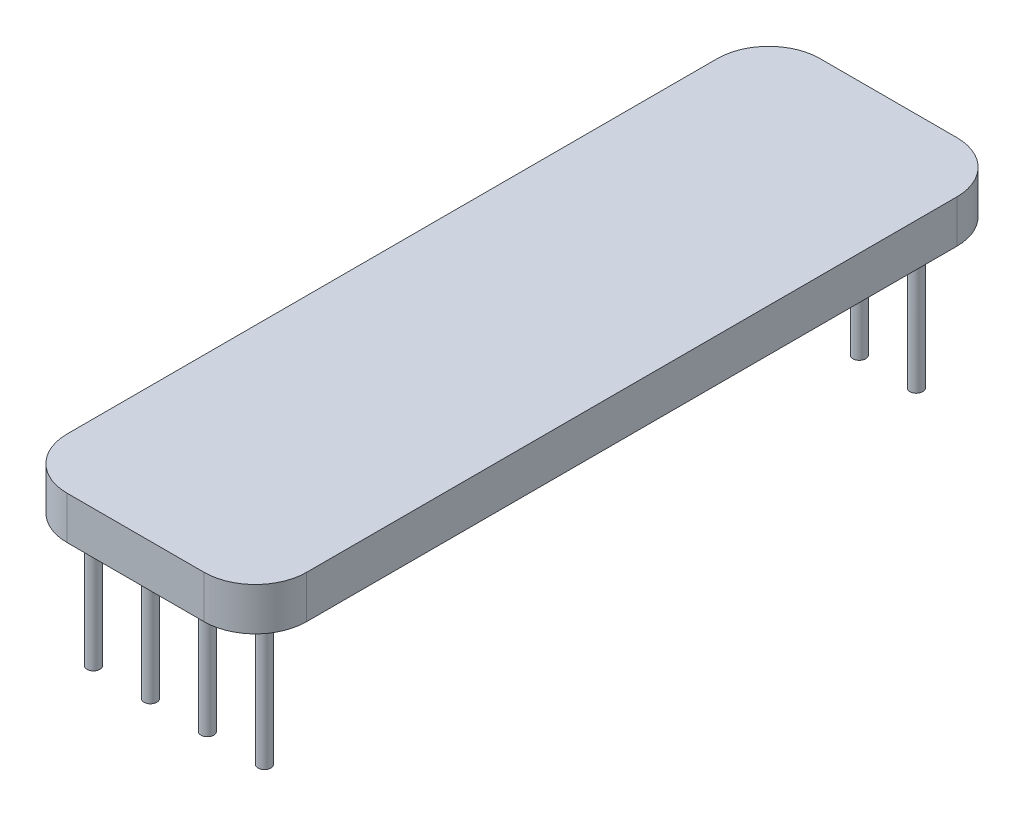
ISO-10303-21;
HEADER;
FILE_DESCRIPTION(('STEP AP214'),'2;1');
FILE_NAME('part.step','',(''),(''),'','','');
FILE_SCHEMA(('AUTOMOTIVE_DESIGN { 1 0 10303 214 1 1 1 1 }'));
ENDSEC;
DATA;
#1=APPLICATION_CONTEXT('core data for automotive mechanical design processes');
#2=APPLICATION_PROTOCOL_DEFINITION('international standard','automotive_design',2000,#1);
#3=PRODUCT_CONTEXT('',#1,'mechanical');
#4=PRODUCT('Part','Part','',(#3));
#5=PRODUCT_RELATED_PRODUCT_CATEGORY('part','',(#4));
#6=PRODUCT_DEFINITION_FORMATION('','',#4);
#7=PRODUCT_DEFINITION_CONTEXT('part definition',#1,'design');
#8=PRODUCT_DEFINITION('design','',#6,#7);
#9=PRODUCT_DEFINITION_SHAPE('','',#8);
#10=(LENGTH_UNIT() NAMED_UNIT(*) SI_UNIT(.MILLI.,.METRE.));
#11=(NAMED_UNIT(*) PLANE_ANGLE_UNIT() SI_UNIT($,.RADIAN.));
#12=(NAMED_UNIT(*) SI_UNIT($,.STERADIAN.) SOLID_ANGLE_UNIT());
#13=UNCERTAINTY_MEASURE_WITH_UNIT(LENGTH_MEASURE(1.E-05),#10,'distance_accuracy_value','');
#14=(GEOMETRIC_REPRESENTATION_CONTEXT(3) GLOBAL_UNCERTAINTY_ASSIGNED_CONTEXT((#13)) GLOBAL_UNIT_ASSIGNED_CONTEXT((#10,
#11,#12)) REPRESENTATION_CONTEXT('',''));
#15=CARTESIAN_POINT('',(0.,0.,0.));
#16=DIRECTION('',(0.,0.,1.));
#17=DIRECTION('',(1.,0.,0.));
#18=AXIS2_PLACEMENT_3D('',#15,#16,#17);
#19=CARTESIAN_POINT('',(4.,0.,-19.));
#20=DIRECTION('',(0.,1.,0.));
#21=DIRECTION('',(0.,0.,1.));
#22=AXIS2_PLACEMENT_3D('',#19,#20,#21);
#23=PLANE('',#22);
#24=CARTESIAN_POINT('',(1.66,0.,-18.64));
#25=DIRECTION('',(0.,1.,0.));
#26=DIRECTION('',(0.,0.,1.));
#27=AXIS2_PLACEMENT_3D('',#24,#25,#26);
#28=CIRCLE('',#27,0.375);
#29=CARTESIAN_POINT('',(1.66,0.,-18.265));
#30=VERTEX_POINT('',#29);
#31=EDGE_CURVE('E44',#30,#30,#28,.F.);
#32=ORIENTED_EDGE('',*,*,#31,.F.);
#33=EDGE_LOOP('',(#32));
#34=FACE_BOUND('',#33,.T.);
#35=CARTESIAN_POINT('',(-5.,0.,-18.64));
#36=DIRECTION('',(0.,1.,0.));
#37=DIRECTION('',(0.,0.,1.));
#38=AXIS2_PLACEMENT_3D('',#35,#36,#37);
#39=CIRCLE('',#38,0.375);
#40=CARTESIAN_POINT('',(-5.,0.,-18.265));
#41=VERTEX_POINT('',#40);
#42=EDGE_CURVE('E175',#41,#41,#39,.F.);
#43=ORIENTED_EDGE('',*,*,#42,.F.);
#44=EDGE_LOOP('',(#43));
#45=FACE_BOUND('',#44,.T.);
#46=CARTESIAN_POINT('',(1.66,0.,19.46));
#47=DIRECTION('',(0.,1.,0.));
#48=DIRECTION('',(0.,0.,1.));
#49=AXIS2_PLACEMENT_3D('',#46,#47,#48);
#50=CIRCLE('',#49,0.375);
#51=CARTESIAN_POINT('',(1.66,0.,19.835));
#52=VERTEX_POINT('',#51);
#53=EDGE_CURVE('E169',#52,#52,#50,.F.);
#54=ORIENTED_EDGE('',*,*,#53,.F.);
#55=EDGE_LOOP('',(#54));
#56=FACE_BOUND('',#55,.T.);
#57=CARTESIAN_POINT('',(-5.,0.,19.46));
#58=DIRECTION('',(0.,1.,0.));
#59=DIRECTION('',(0.,0.,1.));
#60=AXIS2_PLACEMENT_3D('',#57,#58,#59);
#61=CIRCLE('',#60,0.375);
#62=CARTESIAN_POINT('',(-5.,0.,19.835));
#63=VERTEX_POINT('',#62);
#64=EDGE_CURVE('E163',#63,#63,#61,.F.);
#65=ORIENTED_EDGE('',*,*,#64,.F.);
#66=EDGE_LOOP('',(#65));
#67=FACE_BOUND('',#66,.T.);
#68=CARTESIAN_POINT('',(4.,0.,-19.));
#69=DIRECTION('',(0.,1.,0.));
#70=DIRECTION('',(0.,0.,1.));
#71=AXIS2_PLACEMENT_3D('',#68,#69,#70);
#72=CIRCLE('',#71,3.);
#73=CARTESIAN_POINT('',(7.,0.,-19.));
#74=VERTEX_POINT('',#73);
#75=CARTESIAN_POINT('',(3.99999999999998,0.,-22.));
#76=VERTEX_POINT('',#75);
#77=EDGE_CURVE('E133',#74,#76,#72,.T.);
#78=ORIENTED_EDGE('',*,*,#77,.F.);
#79=DIRECTION('',(0.,0.,-1.));
#80=VECTOR('',#79,1.);
#81=CARTESIAN_POINT('',(7.,0.,-19.));
#82=LINE('',#81,#80);
#83=CARTESIAN_POINT('',(7.00000000000001,0.,19.));
#84=VERTEX_POINT('',#83);
#85=EDGE_CURVE('E87',#84,#74,#82,.T.);
#86=ORIENTED_EDGE('',*,*,#85,.F.);
#87=CARTESIAN_POINT('',(4.00000000000001,0.,19.));
#88=DIRECTION('',(0.,1.,0.));
#89=DIRECTION('',(0.,0.,1.));
#90=AXIS2_PLACEMENT_3D('',#87,#88,#89);
#91=CIRCLE('',#90,3.);
#92=CARTESIAN_POINT('',(3.99999999999999,0.,22.));
#93=VERTEX_POINT('',#92);
#94=EDGE_CURVE('E81',#93,#84,#91,.T.);
#95=ORIENTED_EDGE('',*,*,#94,.F.);
#96=DIRECTION('',(1.,0.,0.));
#97=VECTOR('',#96,1.);
#98=CARTESIAN_POINT('',(-3.99999999999997,0.,22.));
#99=LINE('',#98,#97);
#100=CARTESIAN_POINT('',(-3.99999999999997,0.,22.));
#101=VERTEX_POINT('',#100);
#102=EDGE_CURVE('E123',#101,#93,#99,.T.);
#103=ORIENTED_EDGE('',*,*,#102,.F.);
#104=CARTESIAN_POINT('',(-3.99999999999999,0.,19.));
#105=DIRECTION('',(0.,1.,0.));
#106=DIRECTION('',(0.,0.,1.));
#107=AXIS2_PLACEMENT_3D('',#104,#105,#106);
#108=CIRCLE('',#107,3.);
#109=CARTESIAN_POINT('',(-6.99999999999999,0.,19.));
#110=VERTEX_POINT('',#109);
#111=EDGE_CURVE('E143',#110,#101,#108,.T.);
#112=ORIENTED_EDGE('',*,*,#111,.F.);
#113=DIRECTION('',(0.,0.,1.));
#114=VECTOR('',#113,1.);
#115=CARTESIAN_POINT('',(-7.,0.,-19.));
#116=LINE('',#115,#114);
#117=CARTESIAN_POINT('',(-7.,0.,-19.));
#118=VERTEX_POINT('',#117);
#119=EDGE_CURVE('E141',#118,#110,#116,.T.);
#120=ORIENTED_EDGE('',*,*,#119,.F.);
#121=CARTESIAN_POINT('',(-4.,0.,-19.));
#122=DIRECTION('',(0.,1.,0.));
#123=DIRECTION('',(0.,0.,1.));
#124=AXIS2_PLACEMENT_3D('',#121,#122,#123);
#125=CIRCLE('',#124,3.);
#126=CARTESIAN_POINT('',(-3.99999999999998,0.,-22.));
#127=VERTEX_POINT('',#126);
#128=EDGE_CURVE('E139',#127,#118,#125,.T.);
#129=ORIENTED_EDGE('',*,*,#128,.F.);
#130=DIRECTION('',(-1.,0.,0.));
#131=VECTOR('',#130,1.);
#132=CARTESIAN_POINT('',(-3.99999999999998,0.,-22.));
#133=LINE('',#132,#131);
#134=EDGE_CURVE('E136',#76,#127,#133,.T.);
#135=ORIENTED_EDGE('',*,*,#134,.F.);
#136=EDGE_LOOP('',(#78,#86,#95,#103,#112,#120,#129,#135));
#137=FACE_BOUND('',#136,.T.);
#138=CARTESIAN_POINT('',(-1.67,0.,19.46));
#139=DIRECTION('',(0.,1.,0.));
#140=DIRECTION('',(0.,0.,1.));
#141=AXIS2_PLACEMENT_3D('',#138,#139,#140);
#142=CIRCLE('',#141,0.375);
#143=CARTESIAN_POINT('',(-1.67,0.,19.835));
#144=VERTEX_POINT('',#143);
#145=EDGE_CURVE('E166',#144,#144,#142,.F.);
#146=ORIENTED_EDGE('',*,*,#145,.F.);
#147=EDGE_LOOP('',(#146));
#148=FACE_BOUND('',#147,.T.);
#149=CARTESIAN_POINT('',(4.99,0.,19.46));
#150=DIRECTION('',(0.,1.,0.));
#151=DIRECTION('',(0.,0.,1.));
#152=AXIS2_PLACEMENT_3D('',#149,#150,#151);
#153=CIRCLE('',#152,0.375);
#154=CARTESIAN_POINT('',(4.99,0.,19.835));
#155=VERTEX_POINT('',#154);
#156=EDGE_CURVE('E172',#155,#155,#153,.F.);
#157=ORIENTED_EDGE('',*,*,#156,.F.);
#158=EDGE_LOOP('',(#157));
#159=FACE_BOUND('',#158,.T.);
#160=CARTESIAN_POINT('',(-1.67,0.,-18.64));
#161=DIRECTION('',(0.,1.,0.));
#162=DIRECTION('',(0.,0.,1.));
#163=AXIS2_PLACEMENT_3D('',#160,#161,#162);
#164=CIRCLE('',#163,0.375);
#165=CARTESIAN_POINT('',(-1.67,0.,-18.265));
#166=VERTEX_POINT('',#165);
#167=EDGE_CURVE('E178',#166,#166,#164,.F.);
#168=ORIENTED_EDGE('',*,*,#167,.F.);
#169=EDGE_LOOP('',(#168));
#170=FACE_BOUND('',#169,.T.);
#171=CARTESIAN_POINT('',(4.99,0.,-18.64));
#172=DIRECTION('',(0.,1.,0.));
#173=DIRECTION('',(0.,0.,1.));
#174=AXIS2_PLACEMENT_3D('',#171,#172,#173);
#175=CIRCLE('',#174,0.375);
#176=CARTESIAN_POINT('',(4.99,0.,-18.265));
#177=VERTEX_POINT('',#176);
#178=EDGE_CURVE('E11',#177,#177,#175,.F.);
#179=ORIENTED_EDGE('',*,*,#178,.F.);
#180=EDGE_LOOP('',(#179));
#181=FACE_BOUND('',#180,.T.);
#182=ADVANCED_FACE('F35',(#34,#45,#56,#67,#137,#148,#159,#170,#181),#23,.F.);
#183=CARTESIAN_POINT('',(4.,2.5,-19.));
#184=DIRECTION('',(0.,-1.,0.));
#185=DIRECTION('',(0.,0.,-1.));
#186=AXIS2_PLACEMENT_3D('',#183,#184,#185);
#187=CYLINDRICAL_SURFACE('',#186,3.);
#188=ORIENTED_EDGE('',*,*,#77,.T.);
#189=DIRECTION('',(0.,-1.,0.));
#190=VECTOR('',#189,1.);
#191=CARTESIAN_POINT('',(3.99999999999998,2.5,-22.));
#192=LINE('',#191,#190);
#193=CARTESIAN_POINT('',(3.99999999999998,2.5,-22.));
#194=VERTEX_POINT('',#193);
#195=EDGE_CURVE('E161',#194,#76,#192,.T.);
#196=ORIENTED_EDGE('',*,*,#195,.F.);
#197=CARTESIAN_POINT('',(4.,2.5,-19.));
#198=DIRECTION('',(0.,1.,0.));
#199=DIRECTION('',(0.,0.,1.));
#200=AXIS2_PLACEMENT_3D('',#197,#198,#199);
#201=CIRCLE('',#200,3.);
#202=CARTESIAN_POINT('',(7.,2.5,-19.));
#203=VERTEX_POINT('',#202);
#204=EDGE_CURVE('E148',#203,#194,#201,.T.);
#205=ORIENTED_EDGE('',*,*,#204,.F.);
#206=DIRECTION('',(0.,-1.,0.));
#207=VECTOR('',#206,1.);
#208=CARTESIAN_POINT('',(7.,2.5,-19.));
#209=LINE('',#208,#207);
#210=EDGE_CURVE('E129',#203,#74,#209,.T.);
#211=ORIENTED_EDGE('',*,*,#210,.T.);
#212=EDGE_LOOP('',(#188,#196,#205,#211));
#213=FACE_BOUND('',#212,.T.);
#214=ADVANCED_FACE('F37',(#213),#187,.T.);
#215=CARTESIAN_POINT('',(-3.99999999999998,2.5,-22.));
#216=DIRECTION('',(0.,0.,1.));
#217=DIRECTION('',(1.,0.,0.));
#218=AXIS2_PLACEMENT_3D('',#215,#216,#217);
#219=PLANE('',#218);
#220=ORIENTED_EDGE('',*,*,#134,.T.);
#221=DIRECTION('',(0.,-1.,0.));
#222=VECTOR('',#221,1.);
#223=CARTESIAN_POINT('',(-3.99999999999998,2.5,-22.));
#224=LINE('',#223,#222);
#225=CARTESIAN_POINT('',(-3.99999999999998,2.5,-22.));
#226=VERTEX_POINT('',#225);
#227=EDGE_CURVE('E158',#226,#127,#224,.T.);
#228=ORIENTED_EDGE('',*,*,#227,.F.);
#229=DIRECTION('',(-1.,0.,0.));
#230=VECTOR('',#229,1.);
#231=CARTESIAN_POINT('',(-3.99999999999998,2.5,-22.));
#232=LINE('',#231,#230);
#233=EDGE_CURVE('E96',#194,#226,#232,.T.);
#234=ORIENTED_EDGE('',*,*,#233,.F.);
#235=ORIENTED_EDGE('',*,*,#195,.T.);
#236=EDGE_LOOP('',(#220,#228,#234,#235));
#237=FACE_BOUND('',#236,.T.);
#238=ADVANCED_FACE('F290',(#237),#219,.F.);
#239=CARTESIAN_POINT('',(-4.,2.5,-19.));
#240=DIRECTION('',(0.,-1.,0.));
#241=DIRECTION('',(0.,0.,-1.));
#242=AXIS2_PLACEMENT_3D('',#239,#240,#241);
#243=CYLINDRICAL_SURFACE('',#242,3.);
#244=ORIENTED_EDGE('',*,*,#128,.T.);
#245=DIRECTION('',(0.,-1.,0.));
#246=VECTOR('',#245,1.);
#247=CARTESIAN_POINT('',(-7.,2.5,-19.));
#248=LINE('',#247,#246);
#249=CARTESIAN_POINT('',(-7.,2.5,-19.));
#250=VERTEX_POINT('',#249);
#251=EDGE_CURVE('E155',#250,#118,#248,.T.);
#252=ORIENTED_EDGE('',*,*,#251,.F.);
#253=CARTESIAN_POINT('',(-4.,2.5,-19.));
#254=DIRECTION('',(0.,1.,0.));
#255=DIRECTION('',(0.,0.,1.));
#256=AXIS2_PLACEMENT_3D('',#253,#254,#255);
#257=CIRCLE('',#256,3.);
#258=EDGE_CURVE('E301',#226,#250,#257,.T.);
#259=ORIENTED_EDGE('',*,*,#258,.F.);
#260=ORIENTED_EDGE('',*,*,#227,.T.);
#261=EDGE_LOOP('',(#244,#252,#259,#260));
#262=FACE_BOUND('',#261,.T.);
#263=ADVANCED_FACE('F287',(#262),#243,.T.);
#264=CARTESIAN_POINT('',(-7.,2.5,-19.));
#265=DIRECTION('',(1.,0.,0.));
#266=DIRECTION('',(0.,0.,-1.));
#267=AXIS2_PLACEMENT_3D('',#264,#265,#266);
#268=PLANE('',#267);
#269=ORIENTED_EDGE('',*,*,#119,.T.);
#270=DIRECTION('',(0.,-1.,0.));
#271=VECTOR('',#270,1.);
#272=CARTESIAN_POINT('',(-6.99999999999999,2.5,19.));
#273=LINE('',#272,#271);
#274=CARTESIAN_POINT('',(-6.99999999999999,2.5,19.));
#275=VERTEX_POINT('',#274);
#276=EDGE_CURVE('E152',#275,#110,#273,.T.);
#277=ORIENTED_EDGE('',*,*,#276,.F.);
#278=DIRECTION('',(0.,0.,1.));
#279=VECTOR('',#278,1.);
#280=CARTESIAN_POINT('',(-7.,2.5,-19.));
#281=LINE('',#280,#279);
#282=EDGE_CURVE('E306',#250,#275,#281,.T.);
#283=ORIENTED_EDGE('',*,*,#282,.F.);
#284=ORIENTED_EDGE('',*,*,#251,.T.);
#285=EDGE_LOOP('',(#269,#277,#283,#284));
#286=FACE_BOUND('',#285,.T.);
#287=ADVANCED_FACE('F283',(#286),#268,.F.);
#288=CARTESIAN_POINT('',(-3.99999999999999,2.5,19.));
#289=DIRECTION('',(0.,-1.,0.));
#290=DIRECTION('',(0.,0.,-1.));
#291=AXIS2_PLACEMENT_3D('',#288,#289,#290);
#292=CYLINDRICAL_SURFACE('',#291,3.);
#293=ORIENTED_EDGE('',*,*,#111,.T.);
#294=DIRECTION('',(0.,-1.,0.));
#295=VECTOR('',#294,1.);
#296=CARTESIAN_POINT('',(-3.99999999999997,2.5,22.));
#297=LINE('',#296,#295);
#298=CARTESIAN_POINT('',(-3.99999999999997,2.5,22.));
#299=VERTEX_POINT('',#298);
#300=EDGE_CURVE('E124',#299,#101,#297,.T.);
#301=ORIENTED_EDGE('',*,*,#300,.F.);
#302=CARTESIAN_POINT('',(-3.99999999999999,2.5,19.));
#303=DIRECTION('',(0.,1.,0.));
#304=DIRECTION('',(0.,0.,1.));
#305=AXIS2_PLACEMENT_3D('',#302,#303,#304);
#306=CIRCLE('',#305,3.);
#307=EDGE_CURVE('E115',#275,#299,#306,.T.);
#308=ORIENTED_EDGE('',*,*,#307,.F.);
#309=ORIENTED_EDGE('',*,*,#276,.T.);
#310=EDGE_LOOP('',(#293,#301,#308,#309));
#311=FACE_BOUND('',#310,.T.);
#312=ADVANCED_FACE('F280',(#311),#292,.T.);
#313=CARTESIAN_POINT('',(-3.99999999999997,2.5,22.));
#314=DIRECTION('',(0.,0.,-1.));
#315=DIRECTION('',(-1.,0.,0.));
#316=AXIS2_PLACEMENT_3D('',#313,#314,#315);
#317=PLANE('',#316);
#318=ORIENTED_EDGE('',*,*,#102,.T.);
#319=DIRECTION('',(0.,-1.,0.));
#320=VECTOR('',#319,1.);
#321=CARTESIAN_POINT('',(3.99999999999999,2.5,22.));
#322=LINE('',#321,#320);
#323=CARTESIAN_POINT('',(3.99999999999999,2.5,22.));
#324=VERTEX_POINT('',#323);
#325=EDGE_CURVE('E120',#324,#93,#322,.T.);
#326=ORIENTED_EDGE('',*,*,#325,.F.);
#327=DIRECTION('',(1.,0.,0.));
#328=VECTOR('',#327,1.);
#329=CARTESIAN_POINT('',(-3.99999999999997,2.5,22.));
#330=LINE('',#329,#328);
#331=EDGE_CURVE('E109',#299,#324,#330,.T.);
#332=ORIENTED_EDGE('',*,*,#331,.F.);
#333=ORIENTED_EDGE('',*,*,#300,.T.);
#334=EDGE_LOOP('',(#318,#326,#332,#333));
#335=FACE_BOUND('',#334,.T.);
#336=ADVANCED_FACE('F121',(#335),#317,.F.);
#337=CARTESIAN_POINT('',(4.00000000000001,2.5,19.));
#338=DIRECTION('',(0.,-1.,0.));
#339=DIRECTION('',(0.,0.,-1.));
#340=AXIS2_PLACEMENT_3D('',#337,#338,#339);
#341=CYLINDRICAL_SURFACE('',#340,3.);
#342=ORIENTED_EDGE('',*,*,#94,.T.);
#343=DIRECTION('',(0.,-1.,0.));
#344=VECTOR('',#343,1.);
#345=CARTESIAN_POINT('',(7.00000000000001,2.5,19.));
#346=LINE('',#345,#344);
#347=CARTESIAN_POINT('',(7.00000000000001,2.5,19.));
#348=VERTEX_POINT('',#347);
#349=EDGE_CURVE('E125',#348,#84,#346,.T.);
#350=ORIENTED_EDGE('',*,*,#349,.F.);
#351=CARTESIAN_POINT('',(4.00000000000001,2.5,19.));
#352=DIRECTION('',(0.,1.,0.));
#353=DIRECTION('',(0.,0.,1.));
#354=AXIS2_PLACEMENT_3D('',#351,#352,#353);
#355=CIRCLE('',#354,3.);
#356=EDGE_CURVE('E113',#324,#348,#355,.T.);
#357=ORIENTED_EDGE('',*,*,#356,.F.);
#358=ORIENTED_EDGE('',*,*,#325,.T.);
#359=EDGE_LOOP('',(#342,#350,#357,#358));
#360=FACE_BOUND('',#359,.T.);
#361=ADVANCED_FACE('F127',(#360),#341,.T.);
#362=CARTESIAN_POINT('',(7.,2.5,-19.));
#363=DIRECTION('',(-1.,0.,0.));
#364=DIRECTION('',(0.,0.,1.));
#365=AXIS2_PLACEMENT_3D('',#362,#363,#364);
#366=PLANE('',#365);
#367=ORIENTED_EDGE('',*,*,#85,.T.);
#368=ORIENTED_EDGE('',*,*,#210,.F.);
#369=DIRECTION('',(0.,0.,-1.));
#370=VECTOR('',#369,1.);
#371=CARTESIAN_POINT('',(7.,2.5,-19.));
#372=LINE('',#371,#370);
#373=EDGE_CURVE('E52',#348,#203,#372,.T.);
#374=ORIENTED_EDGE('',*,*,#373,.F.);
#375=ORIENTED_EDGE('',*,*,#349,.T.);
#376=EDGE_LOOP('',(#367,#368,#374,#375));
#377=FACE_BOUND('',#376,.T.);
#378=ADVANCED_FACE('F272',(#377),#366,.F.);
#379=CARTESIAN_POINT('',(4.,2.5,-19.));
#380=DIRECTION('',(0.,1.,0.));
#381=DIRECTION('',(0.,0.,1.));
#382=AXIS2_PLACEMENT_3D('',#379,#380,#381);
#383=PLANE('',#382);
#384=ORIENTED_EDGE('',*,*,#204,.T.);
#385=ORIENTED_EDGE('',*,*,#233,.T.);
#386=ORIENTED_EDGE('',*,*,#258,.T.);
#387=ORIENTED_EDGE('',*,*,#282,.T.);
#388=ORIENTED_EDGE('',*,*,#307,.T.);
#389=ORIENTED_EDGE('',*,*,#331,.T.);
#390=ORIENTED_EDGE('',*,*,#356,.T.);
#391=ORIENTED_EDGE('',*,*,#373,.T.);
#392=EDGE_LOOP('',(#384,#385,#386,#387,#388,#389,#390,#391));
#393=FACE_BOUND('',#392,.T.);
#394=ADVANCED_FACE('F111',(#393),#383,.T.);
#395=CARTESIAN_POINT('',(-5.,-8.,19.46));
#396=DIRECTION('',(0.,1.,0.));
#397=DIRECTION('',(0.,0.,1.));
#398=AXIS2_PLACEMENT_3D('',#395,#396,#397);
#399=CYLINDRICAL_SURFACE('',#398,0.375);
#400=CARTESIAN_POINT('',(-5.,-8.,19.46));
#401=DIRECTION('',(0.,-1.,0.));
#402=DIRECTION('',(0.,0.,-1.));
#403=AXIS2_PLACEMENT_3D('',#400,#401,#402);
#404=CIRCLE('',#403,0.375);
#405=CARTESIAN_POINT('',(-5.,-8.,19.085));
#406=VERTEX_POINT('',#405);
#407=EDGE_CURVE('E137',#406,#406,#404,.T.);
#408=ORIENTED_EDGE('',*,*,#407,.F.);
#409=EDGE_LOOP('',(#408));
#410=FACE_BOUND('',#409,.T.);
#411=ORIENTED_EDGE('',*,*,#64,.T.);
#412=EDGE_LOOP('',(#411));
#413=FACE_BOUND('',#412,.T.);
#414=ADVANCED_FACE('F266',(#410,#413),#399,.T.);
#415=CARTESIAN_POINT('',(-5.,-8.,19.46));
#416=DIRECTION('',(0.,-1.,0.));
#417=DIRECTION('',(0.,0.,-1.));
#418=AXIS2_PLACEMENT_3D('',#415,#416,#417);
#419=PLANE('',#418);
#420=ORIENTED_EDGE('',*,*,#407,.T.);
#421=EDGE_LOOP('',(#420));
#422=FACE_BOUND('',#421,.T.);
#423=ADVANCED_FACE('F262',(#422),#419,.T.);
#424=CARTESIAN_POINT('',(-1.67,-8.,19.46));
#425=DIRECTION('',(0.,1.,0.));
#426=DIRECTION('',(0.,0.,1.));
#427=AXIS2_PLACEMENT_3D('',#424,#425,#426);
#428=CYLINDRICAL_SURFACE('',#427,0.375);
#429=CARTESIAN_POINT('',(-1.67,-8.,19.46));
#430=DIRECTION('',(0.,-1.,0.));
#431=DIRECTION('',(0.,0.,-1.));
#432=AXIS2_PLACEMENT_3D('',#429,#430,#431);
#433=CIRCLE('',#432,0.375);
#434=CARTESIAN_POINT('',(-1.67,-8.,19.085));
#435=VERTEX_POINT('',#434);
#436=EDGE_CURVE('E314',#435,#435,#433,.T.);
#437=ORIENTED_EDGE('',*,*,#436,.F.);
#438=EDGE_LOOP('',(#437));
#439=FACE_BOUND('',#438,.T.);
#440=ORIENTED_EDGE('',*,*,#145,.T.);
#441=EDGE_LOOP('',(#440));
#442=FACE_BOUND('',#441,.T.);
#443=ADVANCED_FACE('F258',(#439,#442),#428,.T.);
#444=CARTESIAN_POINT('',(-1.67,-8.,19.46));
#445=DIRECTION('',(0.,-1.,0.));
#446=DIRECTION('',(0.,0.,-1.));
#447=AXIS2_PLACEMENT_3D('',#444,#445,#446);
#448=PLANE('',#447);
#449=ORIENTED_EDGE('',*,*,#436,.T.);
#450=EDGE_LOOP('',(#449));
#451=FACE_BOUND('',#450,.T.);
#452=ADVANCED_FACE('F254',(#451),#448,.T.);
#453=CARTESIAN_POINT('',(1.66,-8.,19.46));
#454=DIRECTION('',(0.,1.,0.));
#455=DIRECTION('',(0.,0.,1.));
#456=AXIS2_PLACEMENT_3D('',#453,#454,#455);
#457=CYLINDRICAL_SURFACE('',#456,0.375);
#458=CARTESIAN_POINT('',(1.66,-8.,19.46));
#459=DIRECTION('',(0.,-1.,0.));
#460=DIRECTION('',(0.,0.,-1.));
#461=AXIS2_PLACEMENT_3D('',#458,#459,#460);
#462=CIRCLE('',#461,0.375);
#463=CARTESIAN_POINT('',(1.66,-8.,19.085));
#464=VERTEX_POINT('',#463);
#465=EDGE_CURVE('E317',#464,#464,#462,.T.);
#466=ORIENTED_EDGE('',*,*,#465,.F.);
#467=EDGE_LOOP('',(#466));
#468=FACE_BOUND('',#467,.T.);
#469=ORIENTED_EDGE('',*,*,#53,.T.);
#470=EDGE_LOOP('',(#469));
#471=FACE_BOUND('',#470,.T.);
#472=ADVANCED_FACE('F250',(#468,#471),#457,.T.);
#473=CARTESIAN_POINT('',(1.66,-8.,19.46));
#474=DIRECTION('',(0.,-1.,0.));
#475=DIRECTION('',(0.,0.,-1.));
#476=AXIS2_PLACEMENT_3D('',#473,#474,#475);
#477=PLANE('',#476);
#478=ORIENTED_EDGE('',*,*,#465,.T.);
#479=EDGE_LOOP('',(#478));
#480=FACE_BOUND('',#479,.T.);
#481=ADVANCED_FACE('F246',(#480),#477,.T.);
#482=CARTESIAN_POINT('',(4.99,-8.,19.46));
#483=DIRECTION('',(0.,1.,0.));
#484=DIRECTION('',(0.,0.,1.));
#485=AXIS2_PLACEMENT_3D('',#482,#483,#484);
#486=CYLINDRICAL_SURFACE('',#485,0.375);
#487=CARTESIAN_POINT('',(4.99,-8.,19.46));
#488=DIRECTION('',(0.,-1.,0.));
#489=DIRECTION('',(0.,0.,-1.));
#490=AXIS2_PLACEMENT_3D('',#487,#488,#489);
#491=CIRCLE('',#490,0.375);
#492=CARTESIAN_POINT('',(4.99,-8.,19.085));
#493=VERTEX_POINT('',#492);
#494=EDGE_CURVE('E320',#493,#493,#491,.T.);
#495=ORIENTED_EDGE('',*,*,#494,.F.);
#496=EDGE_LOOP('',(#495));
#497=FACE_BOUND('',#496,.T.);
#498=ORIENTED_EDGE('',*,*,#156,.T.);
#499=EDGE_LOOP('',(#498));
#500=FACE_BOUND('',#499,.T.);
#501=ADVANCED_FACE('F242',(#497,#500),#486,.T.);
#502=CARTESIAN_POINT('',(4.99,-8.,19.46));
#503=DIRECTION('',(0.,-1.,0.));
#504=DIRECTION('',(0.,0.,-1.));
#505=AXIS2_PLACEMENT_3D('',#502,#503,#504);
#506=PLANE('',#505);
#507=ORIENTED_EDGE('',*,*,#494,.T.);
#508=EDGE_LOOP('',(#507));
#509=FACE_BOUND('',#508,.T.);
#510=ADVANCED_FACE('F238',(#509),#506,.T.);
#511=CARTESIAN_POINT('',(-5.,-8.,-18.64));
#512=DIRECTION('',(0.,1.,0.));
#513=DIRECTION('',(0.,0.,1.));
#514=AXIS2_PLACEMENT_3D('',#511,#512,#513);
#515=CYLINDRICAL_SURFACE('',#514,0.375);
#516=CARTESIAN_POINT('',(-5.,-8.,-18.64));
#517=DIRECTION('',(0.,-1.,0.));
#518=DIRECTION('',(0.,0.,-1.));
#519=AXIS2_PLACEMENT_3D('',#516,#517,#518);
#520=CIRCLE('',#519,0.375);
#521=CARTESIAN_POINT('',(-5.,-8.,-19.015));
#522=VERTEX_POINT('',#521);
#523=EDGE_CURVE('E323',#522,#522,#520,.T.);
#524=ORIENTED_EDGE('',*,*,#523,.F.);
#525=EDGE_LOOP('',(#524));
#526=FACE_BOUND('',#525,.T.);
#527=ORIENTED_EDGE('',*,*,#42,.T.);
#528=EDGE_LOOP('',(#527));
#529=FACE_BOUND('',#528,.T.);
#530=ADVANCED_FACE('F234',(#526,#529),#515,.T.);
#531=CARTESIAN_POINT('',(-5.,-8.,-18.64));
#532=DIRECTION('',(0.,-1.,0.));
#533=DIRECTION('',(0.,0.,-1.));
#534=AXIS2_PLACEMENT_3D('',#531,#532,#533);
#535=PLANE('',#534);
#536=ORIENTED_EDGE('',*,*,#523,.T.);
#537=EDGE_LOOP('',(#536));
#538=FACE_BOUND('',#537,.T.);
#539=ADVANCED_FACE('F230',(#538),#535,.T.);
#540=CARTESIAN_POINT('',(-1.67,-8.,-18.64));
#541=DIRECTION('',(0.,1.,0.));
#542=DIRECTION('',(0.,0.,1.));
#543=AXIS2_PLACEMENT_3D('',#540,#541,#542);
#544=CYLINDRICAL_SURFACE('',#543,0.375);
#545=CARTESIAN_POINT('',(-1.67,-8.,-18.64));
#546=DIRECTION('',(0.,-1.,0.));
#547=DIRECTION('',(0.,0.,-1.));
#548=AXIS2_PLACEMENT_3D('',#545,#546,#547);
#549=CIRCLE('',#548,0.375);
#550=CARTESIAN_POINT('',(-1.67,-8.,-19.015));
#551=VERTEX_POINT('',#550);
#552=EDGE_CURVE('E326',#551,#551,#549,.T.);
#553=ORIENTED_EDGE('',*,*,#552,.F.);
#554=EDGE_LOOP('',(#553));
#555=FACE_BOUND('',#554,.T.);
#556=ORIENTED_EDGE('',*,*,#167,.T.);
#557=EDGE_LOOP('',(#556));
#558=FACE_BOUND('',#557,.T.);
#559=ADVANCED_FACE('F226',(#555,#558),#544,.T.);
#560=CARTESIAN_POINT('',(-1.67,-8.,-18.64));
#561=DIRECTION('',(0.,-1.,0.));
#562=DIRECTION('',(0.,0.,-1.));
#563=AXIS2_PLACEMENT_3D('',#560,#561,#562);
#564=PLANE('',#563);
#565=ORIENTED_EDGE('',*,*,#552,.T.);
#566=EDGE_LOOP('',(#565));
#567=FACE_BOUND('',#566,.T.);
#568=ADVANCED_FACE('F222',(#567),#564,.T.);
#569=CARTESIAN_POINT('',(1.66,-8.,-18.64));
#570=DIRECTION('',(0.,1.,0.));
#571=DIRECTION('',(0.,0.,1.));
#572=AXIS2_PLACEMENT_3D('',#569,#570,#571);
#573=CYLINDRICAL_SURFACE('',#572,0.375);
#574=CARTESIAN_POINT('',(1.66,-8.,-18.64));
#575=DIRECTION('',(0.,-1.,0.));
#576=DIRECTION('',(0.,0.,-1.));
#577=AXIS2_PLACEMENT_3D('',#574,#575,#576);
#578=CIRCLE('',#577,0.375);
#579=CARTESIAN_POINT('',(1.66,-8.,-19.015));
#580=VERTEX_POINT('',#579);
#581=EDGE_CURVE('E329',#580,#580,#578,.T.);
#582=ORIENTED_EDGE('',*,*,#581,.F.);
#583=EDGE_LOOP('',(#582));
#584=FACE_BOUND('',#583,.T.);
#585=ORIENTED_EDGE('',*,*,#31,.T.);
#586=EDGE_LOOP('',(#585));
#587=FACE_BOUND('',#586,.T.);
#588=ADVANCED_FACE('F183',(#584,#587),#573,.T.);
#589=CARTESIAN_POINT('',(1.66,-8.,-18.64));
#590=DIRECTION('',(0.,-1.,0.));
#591=DIRECTION('',(0.,0.,-1.));
#592=AXIS2_PLACEMENT_3D('',#589,#590,#591);
#593=PLANE('',#592);
#594=ORIENTED_EDGE('',*,*,#581,.T.);
#595=EDGE_LOOP('',(#594));
#596=FACE_BOUND('',#595,.T.);
#597=ADVANCED_FACE('F207',(#596),#593,.T.);
#598=CARTESIAN_POINT('',(4.99,-8.,-18.64));
#599=DIRECTION('',(0.,1.,0.));
#600=DIRECTION('',(0.,0.,1.));
#601=AXIS2_PLACEMENT_3D('',#598,#599,#600);
#602=CYLINDRICAL_SURFACE('',#601,0.375);
#603=CARTESIAN_POINT('',(4.99,-8.,-18.64));
#604=DIRECTION('',(0.,-1.,0.));
#605=DIRECTION('',(0.,0.,-1.));
#606=AXIS2_PLACEMENT_3D('',#603,#604,#605);
#607=CIRCLE('',#606,0.375);
#608=CARTESIAN_POINT('',(4.99,-8.,-19.015));
#609=VERTEX_POINT('',#608);
#610=EDGE_CURVE('E332',#609,#609,#607,.T.);
#611=ORIENTED_EDGE('',*,*,#610,.F.);
#612=EDGE_LOOP('',(#611));
#613=FACE_BOUND('',#612,.T.);
#614=ORIENTED_EDGE('',*,*,#178,.T.);
#615=EDGE_LOOP('',(#614));
#616=FACE_BOUND('',#615,.T.);
#617=ADVANCED_FACE('F204',(#613,#616),#602,.T.);
#618=CARTESIAN_POINT('',(4.99,-8.,-18.64));
#619=DIRECTION('',(0.,-1.,0.));
#620=DIRECTION('',(0.,0.,-1.));
#621=AXIS2_PLACEMENT_3D('',#618,#619,#620);
#622=PLANE('',#621);
#623=ORIENTED_EDGE('',*,*,#610,.T.);
#624=EDGE_LOOP('',(#623));
#625=FACE_BOUND('',#624,.T.);
#626=ADVANCED_FACE('F206',(#625),#622,.T.);
#627=CLOSED_SHELL('',(#182,#214,#238,#263,#287,#312,#336,#361,#378,#394,#414,#423,#443,#452,
#472,#481,#501,#510,#530,#539,#559,#568,#588,#597,#617,#626));
#628=MANIFOLD_SOLID_BREP('B2',#627);
#629=ADVANCED_BREP_SHAPE_REPRESENTATION('',(#18,#628),#14);
#630=SHAPE_DEFINITION_REPRESENTATION(#9,#629);
ENDSEC;
END-ISO-10303-21;
